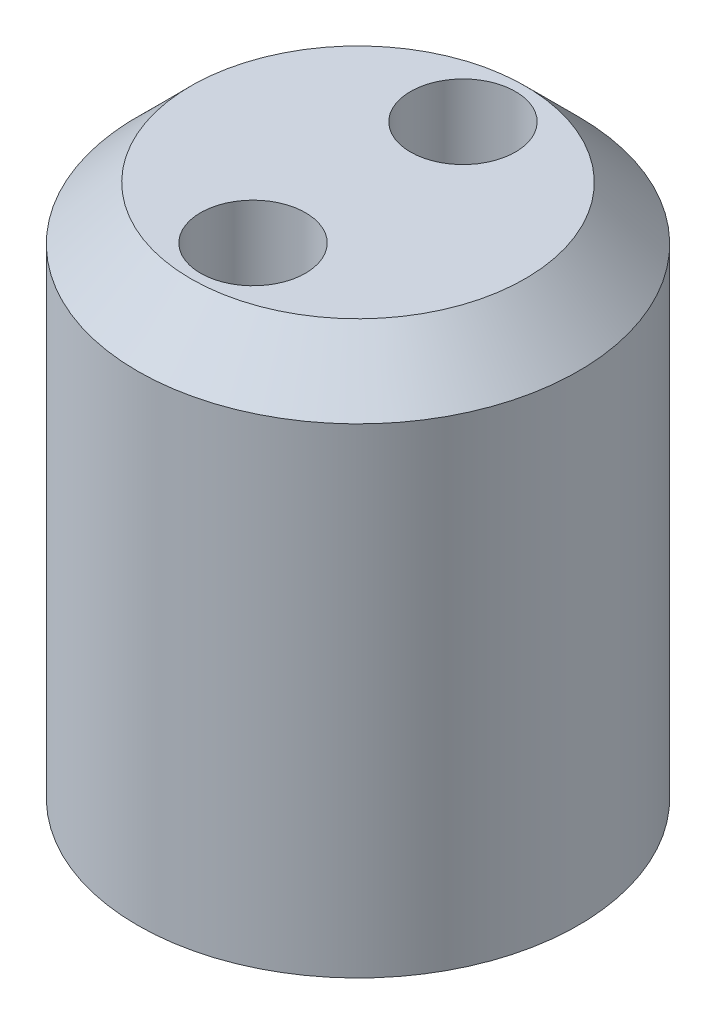
ISO-10303-21;
HEADER;
FILE_DESCRIPTION(('STEP AP214'),'2;1');
FILE_NAME('part.step','',(''),(''),'','','');
FILE_SCHEMA(('AUTOMOTIVE_DESIGN { 1 0 10303 214 1 1 1 1 }'));
ENDSEC;
DATA;
#1=APPLICATION_CONTEXT('core data for automotive mechanical design processes');
#2=APPLICATION_PROTOCOL_DEFINITION('international standard','automotive_design',2000,#1);
#3=PRODUCT_CONTEXT('',#1,'mechanical');
#4=PRODUCT('Part','Part','',(#3));
#5=PRODUCT_RELATED_PRODUCT_CATEGORY('part','',(#4));
#6=PRODUCT_DEFINITION_FORMATION('','',#4);
#7=PRODUCT_DEFINITION_CONTEXT('part definition',#1,'design');
#8=PRODUCT_DEFINITION('design','',#6,#7);
#9=PRODUCT_DEFINITION_SHAPE('','',#8);
#10=(LENGTH_UNIT() NAMED_UNIT(*) SI_UNIT(.MILLI.,.METRE.));
#11=(NAMED_UNIT(*) PLANE_ANGLE_UNIT() SI_UNIT($,.RADIAN.));
#12=(NAMED_UNIT(*) SI_UNIT($,.STERADIAN.) SOLID_ANGLE_UNIT());
#13=UNCERTAINTY_MEASURE_WITH_UNIT(LENGTH_MEASURE(1.E-05),#10,'distance_accuracy_value','');
#14=(GEOMETRIC_REPRESENTATION_CONTEXT(3) GLOBAL_UNCERTAINTY_ASSIGNED_CONTEXT((#13)) GLOBAL_UNIT_ASSIGNED_CONTEXT((#10,
#11,#12)) REPRESENTATION_CONTEXT('',''));
#15=CARTESIAN_POINT('',(0.,0.,0.));
#16=DIRECTION('',(0.,0.,1.));
#17=DIRECTION('',(1.,0.,0.));
#18=AXIS2_PLACEMENT_3D('',#15,#16,#17);
#19=CARTESIAN_POINT('',(0.,25.4,0.));
#20=DIRECTION('',(0.,1.,0.));
#21=DIRECTION('',(0.,0.,1.));
#22=AXIS2_PLACEMENT_3D('',#19,#20,#21);
#23=PLANE('',#22);
#24=CARTESIAN_POINT('',(0.,25.4,0.));
#25=DIRECTION('',(0.,1.,0.));
#26=DIRECTION('',(0.,0.,1.));
#27=AXIS2_PLACEMENT_3D('',#24,#25,#26);
#28=CIRCLE('',#27,7.95999995499999);
#29=CARTESIAN_POINT('',(0.,25.4,7.95999995499999));
#30=VERTEX_POINT('',#29);
#31=EDGE_CURVE('E46',#30,#30,#28,.T.);
#32=ORIENTED_EDGE('',*,*,#31,.T.);
#33=EDGE_LOOP('',(#32));
#34=FACE_BOUND('',#33,.T.);
#35=CARTESIAN_POINT('',(0.,25.4,-5.));
#36=DIRECTION('',(0.,1.,0.));
#37=DIRECTION('',(0.,0.,1.));
#38=AXIS2_PLACEMENT_3D('',#35,#36,#37);
#39=CIRCLE('',#38,2.5);
#40=CARTESIAN_POINT('',(0.,25.4,-2.5));
#41=VERTEX_POINT('',#40);
#42=EDGE_CURVE('E54',#41,#41,#39,.T.);
#43=ORIENTED_EDGE('',*,*,#42,.F.);
#44=EDGE_LOOP('',(#43));
#45=FACE_BOUND('',#44,.T.);
#46=CARTESIAN_POINT('',(0.,25.4,5.));
#47=DIRECTION('',(0.,1.,0.));
#48=DIRECTION('',(0.,0.,1.));
#49=AXIS2_PLACEMENT_3D('',#46,#47,#48);
#50=CIRCLE('',#49,2.5);
#51=CARTESIAN_POINT('',(0.,25.4,7.5));
#52=VERTEX_POINT('',#51);
#53=EDGE_CURVE('E60',#52,#52,#50,.T.);
#54=ORIENTED_EDGE('',*,*,#53,.F.);
#55=EDGE_LOOP('',(#54));
#56=FACE_BOUND('',#55,.T.);
#57=ADVANCED_FACE('F38',(#34,#45,#56),#23,.T.);
#58=CARTESIAN_POINT('',(0.,0.,0.));
#59=DIRECTION('',(0.,1.,0.));
#60=DIRECTION('',(0.,0.,1.));
#61=AXIS2_PLACEMENT_3D('',#58,#59,#60);
#62=PLANE('',#61);
#63=CARTESIAN_POINT('',(0.,0.,0.));
#64=DIRECTION('',(0.,1.,0.));
#65=DIRECTION('',(0.,0.,1.));
#66=AXIS2_PLACEMENT_3D('',#63,#64,#65);
#67=CIRCLE('',#66,10.499999955);
#68=CARTESIAN_POINT('',(0.,0.,10.499999955));
#69=VERTEX_POINT('',#68);
#70=EDGE_CURVE('E50',#69,#69,#67,.T.);
#71=ORIENTED_EDGE('',*,*,#70,.F.);
#72=EDGE_LOOP('',(#71));
#73=FACE_BOUND('',#72,.T.);
#74=CARTESIAN_POINT('',(0.,0.,-5.));
#75=DIRECTION('',(0.,1.,0.));
#76=DIRECTION('',(0.,0.,1.));
#77=AXIS2_PLACEMENT_3D('',#74,#75,#76);
#78=CIRCLE('',#77,2.5);
#79=CARTESIAN_POINT('',(0.,0.,-2.5));
#80=VERTEX_POINT('',#79);
#81=EDGE_CURVE('E57',#80,#80,#78,.T.);
#82=ORIENTED_EDGE('',*,*,#81,.T.);
#83=EDGE_LOOP('',(#82));
#84=FACE_BOUND('',#83,.T.);
#85=CARTESIAN_POINT('',(0.,0.,5.));
#86=DIRECTION('',(0.,1.,0.));
#87=DIRECTION('',(0.,0.,1.));
#88=AXIS2_PLACEMENT_3D('',#85,#86,#87);
#89=CIRCLE('',#88,2.5);
#90=CARTESIAN_POINT('',(0.,0.,7.5));
#91=VERTEX_POINT('',#90);
#92=EDGE_CURVE('E63',#91,#91,#89,.T.);
#93=ORIENTED_EDGE('',*,*,#92,.T.);
#94=EDGE_LOOP('',(#93));
#95=FACE_BOUND('',#94,.T.);
#96=ADVANCED_FACE('F73',(#73,#84,#95),#62,.F.);
#97=CARTESIAN_POINT('',(0.,25.4,0.));
#98=DIRECTION('',(0.,-1.,0.));
#99=DIRECTION('',(0.,0.,-1.));
#100=AXIS2_PLACEMENT_3D('',#97,#98,#99);
#101=CYLINDRICAL_SURFACE('',#100,10.499999955);
#102=CARTESIAN_POINT('',(0.,22.86,0.));
#103=DIRECTION('',(0.,1.,0.));
#104=DIRECTION('',(0.,0.,1.));
#105=AXIS2_PLACEMENT_3D('',#102,#103,#104);
#106=CIRCLE('',#105,10.499999955);
#107=CARTESIAN_POINT('',(0.,22.86,10.499999955));
#108=VERTEX_POINT('',#107);
#109=EDGE_CURVE('E10',#108,#108,#106,.F.);
#110=ORIENTED_EDGE('',*,*,#109,.T.);
#111=EDGE_LOOP('',(#110));
#112=FACE_BOUND('',#111,.T.);
#113=ORIENTED_EDGE('',*,*,#70,.T.);
#114=EDGE_LOOP('',(#113));
#115=FACE_BOUND('',#114,.T.);
#116=ADVANCED_FACE('F80',(#112,#115),#101,.T.);
#117=CARTESIAN_POINT('',(0.,25.4,-5.));
#118=DIRECTION('',(0.,-1.,0.));
#119=DIRECTION('',(0.,0.,-1.));
#120=AXIS2_PLACEMENT_3D('',#117,#118,#119);
#121=CYLINDRICAL_SURFACE('',#120,2.5);
#122=ORIENTED_EDGE('',*,*,#42,.T.);
#123=EDGE_LOOP('',(#122));
#124=FACE_BOUND('',#123,.T.);
#125=ORIENTED_EDGE('',*,*,#81,.F.);
#126=EDGE_LOOP('',(#125));
#127=FACE_BOUND('',#126,.T.);
#128=ADVANCED_FACE('F85',(#124,#127),#121,.F.);
#129=CARTESIAN_POINT('',(0.,25.4,5.));
#130=DIRECTION('',(0.,-1.,0.));
#131=DIRECTION('',(0.,0.,-1.));
#132=AXIS2_PLACEMENT_3D('',#129,#130,#131);
#133=CYLINDRICAL_SURFACE('',#132,2.5);
#134=ORIENTED_EDGE('',*,*,#53,.T.);
#135=EDGE_LOOP('',(#134));
#136=FACE_BOUND('',#135,.T.);
#137=ORIENTED_EDGE('',*,*,#92,.F.);
#138=EDGE_LOOP('',(#137));
#139=FACE_BOUND('',#138,.T.);
#140=ADVANCED_FACE('F69',(#136,#139),#133,.F.);
#141=CARTESIAN_POINT('',(0.,25.4,0.));
#142=DIRECTION('',(0.,-1.,0.));
#143=DIRECTION('',(0.,0.,-1.));
#144=AXIS2_PLACEMENT_3D('',#141,#142,#143);
#145=CONICAL_SURFACE('',#144,7.95999995499999,0.785398163397447);
#146=ORIENTED_EDGE('',*,*,#109,.F.);
#147=EDGE_LOOP('',(#146));
#148=FACE_BOUND('',#147,.T.);
#149=ORIENTED_EDGE('',*,*,#31,.F.);
#150=EDGE_LOOP('',(#149));
#151=FACE_BOUND('',#150,.T.);
#152=ADVANCED_FACE('F41',(#148,#151),#145,.T.);
#153=CLOSED_SHELL('',(#57,#96,#116,#128,#140,#152));
#154=MANIFOLD_SOLID_BREP('B2',#153);
#155=ADVANCED_BREP_SHAPE_REPRESENTATION('',(#18,#154),#14);
#156=SHAPE_DEFINITION_REPRESENTATION(#9,#155);
ENDSEC;
END-ISO-10303-21;
